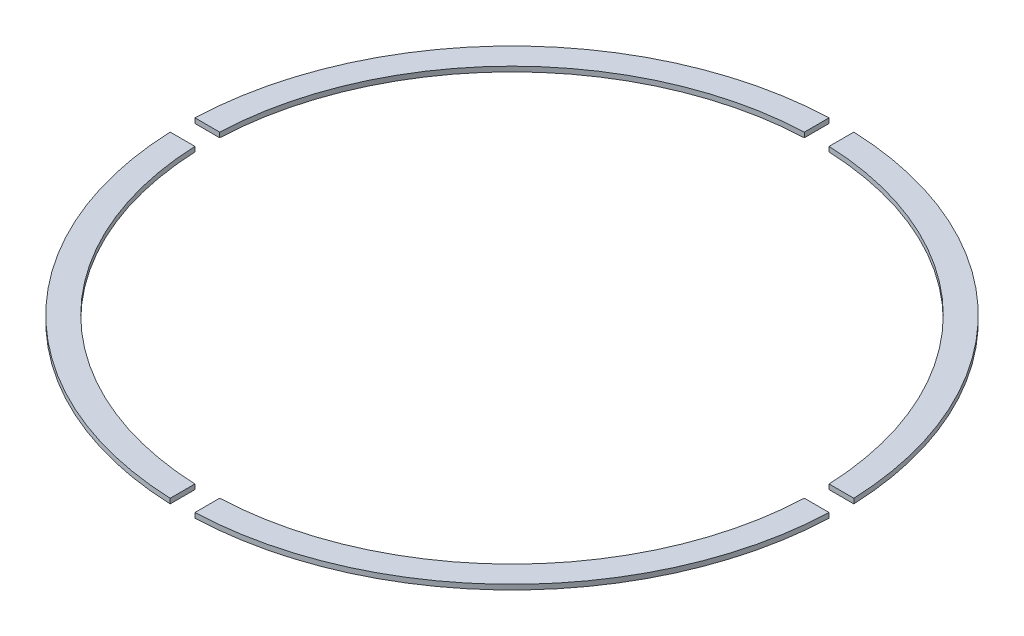
ISO-10303-21;
HEADER;
FILE_DESCRIPTION(('STEP AP214'),'2;1');
FILE_NAME('part.step','',(''),(''),'','','');
FILE_SCHEMA(('AUTOMOTIVE_DESIGN { 1 0 10303 214 1 1 1 1 }'));
ENDSEC;
DATA;
#1=APPLICATION_CONTEXT('core data for automotive mechanical design processes');
#2=APPLICATION_PROTOCOL_DEFINITION('international standard','automotive_design',2000,#1);
#3=PRODUCT_CONTEXT('',#1,'mechanical');
#4=PRODUCT('Part','Part','',(#3));
#5=PRODUCT_RELATED_PRODUCT_CATEGORY('part','',(#4));
#6=PRODUCT_DEFINITION_FORMATION('','',#4);
#7=PRODUCT_DEFINITION_CONTEXT('part definition',#1,'design');
#8=PRODUCT_DEFINITION('design','',#6,#7);
#9=PRODUCT_DEFINITION_SHAPE('','',#8);
#10=(LENGTH_UNIT() NAMED_UNIT(*) SI_UNIT(.MILLI.,.METRE.));
#11=(NAMED_UNIT(*) PLANE_ANGLE_UNIT() SI_UNIT($,.RADIAN.));
#12=(NAMED_UNIT(*) SI_UNIT($,.STERADIAN.) SOLID_ANGLE_UNIT());
#13=UNCERTAINTY_MEASURE_WITH_UNIT(LENGTH_MEASURE(1.E-05),#10,'distance_accuracy_value','');
#14=(GEOMETRIC_REPRESENTATION_CONTEXT(3) GLOBAL_UNCERTAINTY_ASSIGNED_CONTEXT((#13)) GLOBAL_UNIT_ASSIGNED_CONTEXT((#10,
#11,#12)) REPRESENTATION_CONTEXT('',''));
#15=CARTESIAN_POINT('',(0.,0.,0.));
#16=DIRECTION('',(0.,0.,1.));
#17=DIRECTION('',(1.,0.,0.));
#18=AXIS2_PLACEMENT_3D('',#15,#16,#17);
#19=CARTESIAN_POINT('',(0.,1.5,0.));
#20=DIRECTION('',(0.,1.,0.));
#21=DIRECTION('',(0.,0.,1.));
#22=AXIS2_PLACEMENT_3D('',#19,#20,#21);
#23=PLANE('',#22);
#24=DIRECTION('',(0.,0.,-1.));
#25=VECTOR('',#24,1.);
#26=CARTESIAN_POINT('',(7.49999999999945,1.5,-157.644661834944));
#27=LINE('',#26,#25);
#28=CARTESIAN_POINT('',(7.49999999999935,1.5,-184.847910456137));
#29=VERTEX_POINT('',#28);
#30=CARTESIAN_POINT('',(7.4999999999993,1.5,-199.859325526731));
#31=VERTEX_POINT('',#30);
#32=EDGE_CURVE('E12',#29,#31,#27,.T.);
#33=ORIENTED_EDGE('',*,*,#32,.F.);
#34=CARTESIAN_POINT('',(0.,1.5,0.));
#35=DIRECTION('',(0.,1.,0.));
#36=DIRECTION('',(0.,0.,1.));
#37=AXIS2_PLACEMENT_3D('',#34,#35,#36);
#38=CIRCLE('',#37,185.);
#39=CARTESIAN_POINT('',(184.847910456137,1.5,-7.5));
#40=VERTEX_POINT('',#39);
#41=EDGE_CURVE('E46',#40,#29,#38,.T.);
#42=ORIENTED_EDGE('',*,*,#41,.F.);
#43=DIRECTION('',(-1.,0.,0.));
#44=VECTOR('',#43,1.);
#45=CARTESIAN_POINT('',(157.644661834944,1.5,-7.5));
#46=LINE('',#45,#44);
#47=CARTESIAN_POINT('',(199.859325526731,1.5,-7.5));
#48=VERTEX_POINT('',#47);
#49=EDGE_CURVE('E95',#48,#40,#46,.T.);
#50=ORIENTED_EDGE('',*,*,#49,.F.);
#51=CARTESIAN_POINT('',(0.,1.5,0.));
#52=DIRECTION('',(0.,1.,0.));
#53=DIRECTION('',(0.,0.,1.));
#54=AXIS2_PLACEMENT_3D('',#51,#52,#53);
#55=CIRCLE('',#54,200.);
#56=EDGE_CURVE('E92',#48,#31,#55,.T.);
#57=ORIENTED_EDGE('',*,*,#56,.T.);
#58=EDGE_LOOP('',(#33,#42,#50,#57));
#59=FACE_BOUND('',#58,.T.);
#60=ADVANCED_FACE('F43',(#59),#23,.T.);
#61=CARTESIAN_POINT('',(0.,-1.5,0.));
#62=DIRECTION('',(0.,1.,0.));
#63=DIRECTION('',(0.,0.,1.));
#64=AXIS2_PLACEMENT_3D('',#61,#62,#63);
#65=PLANE('',#64);
#66=CARTESIAN_POINT('',(0.,-1.5,0.));
#67=DIRECTION('',(0.,1.,0.));
#68=DIRECTION('',(0.,0.,1.));
#69=AXIS2_PLACEMENT_3D('',#66,#67,#68);
#70=CIRCLE('',#69,185.);
#71=CARTESIAN_POINT('',(184.847910456137,-1.5,-7.5));
#72=VERTEX_POINT('',#71);
#73=CARTESIAN_POINT('',(7.49999999999935,-1.5,-184.847910456137));
#74=VERTEX_POINT('',#73);
#75=EDGE_CURVE('E110',#72,#74,#70,.T.);
#76=ORIENTED_EDGE('',*,*,#75,.T.);
#77=DIRECTION('',(0.,0.,-1.));
#78=VECTOR('',#77,1.);
#79=CARTESIAN_POINT('',(7.49999999999945,-1.5,-157.644661834944));
#80=LINE('',#79,#78);
#81=CARTESIAN_POINT('',(7.4999999999993,-1.5,-199.859325526731));
#82=VERTEX_POINT('',#81);
#83=EDGE_CURVE('E77',#74,#82,#80,.T.);
#84=ORIENTED_EDGE('',*,*,#83,.T.);
#85=CARTESIAN_POINT('',(0.,-1.5,0.));
#86=DIRECTION('',(0.,1.,0.));
#87=DIRECTION('',(0.,0.,1.));
#88=AXIS2_PLACEMENT_3D('',#85,#86,#87);
#89=CIRCLE('',#88,200.);
#90=CARTESIAN_POINT('',(199.859325526731,-1.5,-7.5));
#91=VERTEX_POINT('',#90);
#92=EDGE_CURVE('E103',#91,#82,#89,.T.);
#93=ORIENTED_EDGE('',*,*,#92,.F.);
#94=DIRECTION('',(-1.,0.,0.));
#95=VECTOR('',#94,1.);
#96=CARTESIAN_POINT('',(157.644661834944,-1.5,-7.5));
#97=LINE('',#96,#95);
#98=EDGE_CURVE('E107',#91,#72,#97,.T.);
#99=ORIENTED_EDGE('',*,*,#98,.T.);
#100=EDGE_LOOP('',(#76,#84,#93,#99));
#101=FACE_BOUND('',#100,.T.);
#102=ADVANCED_FACE('F115',(#101),#65,.F.);
#103=CARTESIAN_POINT('',(0.,1.5,0.));
#104=DIRECTION('',(0.,-1.,0.));
#105=DIRECTION('',(0.,0.,-1.));
#106=AXIS2_PLACEMENT_3D('',#103,#104,#105);
#107=CYLINDRICAL_SURFACE('',#106,200.);
#108=ORIENTED_EDGE('',*,*,#92,.T.);
#109=DIRECTION('',(0.,-1.,0.));
#110=VECTOR('',#109,1.);
#111=CARTESIAN_POINT('',(7.4999999999993,1.5,-199.859325526731));
#112=LINE('',#111,#110);
#113=EDGE_CURVE('E60',#82,#31,#112,.F.);
#114=ORIENTED_EDGE('',*,*,#113,.T.);
#115=ORIENTED_EDGE('',*,*,#56,.F.);
#116=DIRECTION('',(0.,-1.,0.));
#117=VECTOR('',#116,1.);
#118=CARTESIAN_POINT('',(199.859325526731,1.5,-7.5));
#119=LINE('',#118,#117);
#120=EDGE_CURVE('E96',#48,#91,#119,.T.);
#121=ORIENTED_EDGE('',*,*,#120,.T.);
#122=EDGE_LOOP('',(#108,#114,#115,#121));
#123=FACE_BOUND('',#122,.T.);
#124=ADVANCED_FACE('F113',(#123),#107,.T.);
#125=CARTESIAN_POINT('',(0.,1.5,0.));
#126=DIRECTION('',(0.,-1.,0.));
#127=DIRECTION('',(0.,0.,-1.));
#128=AXIS2_PLACEMENT_3D('',#125,#126,#127);
#129=CYLINDRICAL_SURFACE('',#128,185.);
#130=DIRECTION('',(0.,-1.,0.));
#131=VECTOR('',#130,1.);
#132=CARTESIAN_POINT('',(7.49999999999935,1.5,-184.847910456137));
#133=LINE('',#132,#131);
#134=EDGE_CURVE('E52',#74,#29,#133,.F.);
#135=ORIENTED_EDGE('',*,*,#134,.F.);
#136=ORIENTED_EDGE('',*,*,#75,.F.);
#137=DIRECTION('',(0.,-1.,0.));
#138=VECTOR('',#137,1.);
#139=CARTESIAN_POINT('',(184.847910456137,1.5,-7.5));
#140=LINE('',#139,#138);
#141=EDGE_CURVE('E85',#40,#72,#140,.T.);
#142=ORIENTED_EDGE('',*,*,#141,.F.);
#143=ORIENTED_EDGE('',*,*,#41,.T.);
#144=EDGE_LOOP('',(#135,#136,#142,#143));
#145=FACE_BOUND('',#144,.T.);
#146=ADVANCED_FACE('F94',(#145),#129,.F.);
#147=CARTESIAN_POINT('',(157.644661834944,-1.5,-7.5));
#148=DIRECTION('',(0.,0.,-1.));
#149=DIRECTION('',(-1.,0.,0.));
#150=AXIS2_PLACEMENT_3D('',#147,#148,#149);
#151=PLANE('',#150);
#152=ORIENTED_EDGE('',*,*,#49,.T.);
#153=ORIENTED_EDGE('',*,*,#141,.T.);
#154=ORIENTED_EDGE('',*,*,#98,.F.);
#155=ORIENTED_EDGE('',*,*,#120,.F.);
#156=EDGE_LOOP('',(#152,#153,#154,#155));
#157=FACE_BOUND('',#156,.T.);
#158=ADVANCED_FACE('F117',(#157),#151,.F.);
#159=CARTESIAN_POINT('',(7.49999999999945,-1.5,-157.644661834944));
#160=DIRECTION('',(1.,0.,0.));
#161=DIRECTION('',(0.,0.,-1.));
#162=AXIS2_PLACEMENT_3D('',#159,#160,#161);
#163=PLANE('',#162);
#164=ORIENTED_EDGE('',*,*,#83,.F.);
#165=ORIENTED_EDGE('',*,*,#134,.T.);
#166=ORIENTED_EDGE('',*,*,#32,.T.);
#167=ORIENTED_EDGE('',*,*,#113,.F.);
#168=EDGE_LOOP('',(#164,#165,#166,#167));
#169=FACE_BOUND('',#168,.T.);
#170=ADVANCED_FACE('F80',(#169),#163,.F.);
#171=CLOSED_SHELL('',(#60,#102,#124,#146,#158,#170));
#172=MANIFOLD_SOLID_BREP('B2',#171);
#173=CARTESIAN_POINT('',(157.644661834944,-1.5,7.5));
#174=DIRECTION('',(0.,0.,1.));
#175=DIRECTION('',(1.,0.,0.));
#176=AXIS2_PLACEMENT_3D('',#173,#174,#175);
#177=PLANE('',#176);
#178=DIRECTION('',(1.,0.,0.));
#179=VECTOR('',#178,1.);
#180=CARTESIAN_POINT('',(157.644661834944,-1.5,7.5));
#181=LINE('',#180,#179);
#182=CARTESIAN_POINT('',(184.847910456137,-1.5,7.5));
#183=VERTEX_POINT('',#182);
#184=CARTESIAN_POINT('',(199.859325526731,-1.5,7.5));
#185=VERTEX_POINT('',#184);
#186=EDGE_CURVE('E238',#183,#185,#181,.T.);
#187=ORIENTED_EDGE('',*,*,#186,.F.);
#188=DIRECTION('',(0.,-1.,0.));
#189=VECTOR('',#188,1.);
#190=CARTESIAN_POINT('',(184.847910456137,1.5,7.5));
#191=LINE('',#190,#189);
#192=CARTESIAN_POINT('',(184.847910456137,1.5,7.5));
#193=VERTEX_POINT('',#192);
#194=EDGE_CURVE('E231',#183,#193,#191,.F.);
#195=ORIENTED_EDGE('',*,*,#194,.T.);
#196=DIRECTION('',(1.,0.,0.));
#197=VECTOR('',#196,1.);
#198=CARTESIAN_POINT('',(157.644661834944,1.5,7.5));
#199=LINE('',#198,#197);
#200=CARTESIAN_POINT('',(199.859325526731,1.5,7.5));
#201=VERTEX_POINT('',#200);
#202=EDGE_CURVE('E228',#193,#201,#199,.T.);
#203=ORIENTED_EDGE('',*,*,#202,.T.);
#204=DIRECTION('',(0.,-1.,0.));
#205=VECTOR('',#204,1.);
#206=CARTESIAN_POINT('',(199.859325526731,1.5,7.5));
#207=LINE('',#206,#205);
#208=EDGE_CURVE('E241',#185,#201,#207,.F.);
#209=ORIENTED_EDGE('',*,*,#208,.F.);
#210=EDGE_LOOP('',(#187,#195,#203,#209));
#211=FACE_BOUND('',#210,.T.);
#212=ADVANCED_FACE('F176',(#211),#177,.F.);
#213=CARTESIAN_POINT('',(0.,1.5,0.));
#214=DIRECTION('',(0.,-1.,0.));
#215=DIRECTION('',(0.,0.,-1.));
#216=AXIS2_PLACEMENT_3D('',#213,#214,#215);
#217=CYLINDRICAL_SURFACE('',#216,185.);
#218=DIRECTION('',(0.,-1.,0.));
#219=VECTOR('',#218,1.);
#220=CARTESIAN_POINT('',(7.50000000000194,1.5,184.847910456137));
#221=LINE('',#220,#219);
#222=CARTESIAN_POINT('',(7.50000000000194,1.5,184.847910456137));
#223=VERTEX_POINT('',#222);
#224=CARTESIAN_POINT('',(7.50000000000194,-1.5,184.847910456137));
#225=VERTEX_POINT('',#224);
#226=EDGE_CURVE('E41',#223,#225,#221,.T.);
#227=ORIENTED_EDGE('',*,*,#226,.F.);
#228=CARTESIAN_POINT('',(0.,1.5,0.));
#229=DIRECTION('',(0.,1.,0.));
#230=DIRECTION('',(0.,0.,1.));
#231=AXIS2_PLACEMENT_3D('',#228,#229,#230);
#232=CIRCLE('',#231,185.);
#233=EDGE_CURVE('E180',#223,#193,#232,.T.);
#234=ORIENTED_EDGE('',*,*,#233,.T.);
#235=ORIENTED_EDGE('',*,*,#194,.F.);
#236=CARTESIAN_POINT('',(0.,-1.5,0.));
#237=DIRECTION('',(0.,1.,0.));
#238=DIRECTION('',(0.,0.,1.));
#239=AXIS2_PLACEMENT_3D('',#236,#237,#238);
#240=CIRCLE('',#239,185.);
#241=EDGE_CURVE('E225',#225,#183,#240,.T.);
#242=ORIENTED_EDGE('',*,*,#241,.F.);
#243=EDGE_LOOP('',(#227,#234,#235,#242));
#244=FACE_BOUND('',#243,.T.);
#245=ADVANCED_FACE('F222',(#244),#217,.F.);
#246=CARTESIAN_POINT('',(0.,1.5,0.));
#247=DIRECTION('',(0.,-1.,0.));
#248=DIRECTION('',(0.,0.,-1.));
#249=AXIS2_PLACEMENT_3D('',#246,#247,#248);
#250=CYLINDRICAL_SURFACE('',#249,200.);
#251=CARTESIAN_POINT('',(0.,1.5,0.));
#252=DIRECTION('',(0.,1.,0.));
#253=DIRECTION('',(0.,0.,1.));
#254=AXIS2_PLACEMENT_3D('',#251,#252,#253);
#255=CIRCLE('',#254,200.);
#256=CARTESIAN_POINT('',(7.50000000000209,1.5,199.859325526731));
#257=VERTEX_POINT('',#256);
#258=EDGE_CURVE('E218',#257,#201,#255,.T.);
#259=ORIENTED_EDGE('',*,*,#258,.F.);
#260=DIRECTION('',(0.,-1.,0.));
#261=VECTOR('',#260,1.);
#262=CARTESIAN_POINT('',(7.50000000000209,1.5,199.859325526731));
#263=LINE('',#262,#261);
#264=CARTESIAN_POINT('',(7.50000000000209,-1.5,199.859325526731));
#265=VERTEX_POINT('',#264);
#266=EDGE_CURVE('E193',#257,#265,#263,.T.);
#267=ORIENTED_EDGE('',*,*,#266,.T.);
#268=CARTESIAN_POINT('',(0.,-1.5,0.));
#269=DIRECTION('',(0.,1.,0.));
#270=DIRECTION('',(0.,0.,1.));
#271=AXIS2_PLACEMENT_3D('',#268,#269,#270);
#272=CIRCLE('',#271,200.);
#273=EDGE_CURVE('E229',#265,#185,#272,.T.);
#274=ORIENTED_EDGE('',*,*,#273,.T.);
#275=ORIENTED_EDGE('',*,*,#208,.T.);
#276=EDGE_LOOP('',(#259,#267,#274,#275));
#277=FACE_BOUND('',#276,.T.);
#278=ADVANCED_FACE('F246',(#277),#250,.T.);
#279=CARTESIAN_POINT('',(0.,-1.5,0.));
#280=DIRECTION('',(0.,1.,0.));
#281=DIRECTION('',(0.,0.,1.));
#282=AXIS2_PLACEMENT_3D('',#279,#280,#281);
#283=PLANE('',#282);
#284=ORIENTED_EDGE('',*,*,#273,.F.);
#285=DIRECTION('',(0.,0.,-1.));
#286=VECTOR('',#285,1.);
#287=CARTESIAN_POINT('',(7.50000000000165,-1.5,157.644661834944));
#288=LINE('',#287,#286);
#289=EDGE_CURVE('E197',#265,#225,#288,.T.);
#290=ORIENTED_EDGE('',*,*,#289,.T.);
#291=ORIENTED_EDGE('',*,*,#241,.T.);
#292=ORIENTED_EDGE('',*,*,#186,.T.);
#293=EDGE_LOOP('',(#284,#290,#291,#292));
#294=FACE_BOUND('',#293,.T.);
#295=ADVANCED_FACE('F250',(#294),#283,.F.);
#296=CARTESIAN_POINT('',(0.,1.5,0.));
#297=DIRECTION('',(0.,1.,0.));
#298=DIRECTION('',(0.,0.,1.));
#299=AXIS2_PLACEMENT_3D('',#296,#297,#298);
#300=PLANE('',#299);
#301=DIRECTION('',(0.,0.,-1.));
#302=VECTOR('',#301,1.);
#303=CARTESIAN_POINT('',(7.50000000000165,1.5,157.644661834944));
#304=LINE('',#303,#302);
#305=EDGE_CURVE('E185',#257,#223,#304,.T.);
#306=ORIENTED_EDGE('',*,*,#305,.F.);
#307=ORIENTED_EDGE('',*,*,#258,.T.);
#308=ORIENTED_EDGE('',*,*,#202,.F.);
#309=ORIENTED_EDGE('',*,*,#233,.F.);
#310=EDGE_LOOP('',(#306,#307,#308,#309));
#311=FACE_BOUND('',#310,.T.);
#312=ADVANCED_FACE('F178',(#311),#300,.T.);
#313=CARTESIAN_POINT('',(7.50000000000165,-1.5,157.644661834944));
#314=DIRECTION('',(1.,0.,0.));
#315=DIRECTION('',(0.,0.,-1.));
#316=AXIS2_PLACEMENT_3D('',#313,#314,#315);
#317=PLANE('',#316);
#318=ORIENTED_EDGE('',*,*,#305,.T.);
#319=ORIENTED_EDGE('',*,*,#226,.T.);
#320=ORIENTED_EDGE('',*,*,#289,.F.);
#321=ORIENTED_EDGE('',*,*,#266,.F.);
#322=EDGE_LOOP('',(#318,#319,#320,#321));
#323=FACE_BOUND('',#322,.T.);
#324=ADVANCED_FACE('F214',(#323),#317,.F.);
#325=CLOSED_SHELL('',(#212,#245,#278,#295,#312,#324));
#326=MANIFOLD_SOLID_BREP('B6',#325);
#327=CARTESIAN_POINT('',(0.,1.5,0.));
#328=DIRECTION('',(0.,-1.,0.));
#329=DIRECTION('',(0.,0.,-1.));
#330=AXIS2_PLACEMENT_3D('',#327,#328,#329);
#331=CYLINDRICAL_SURFACE('',#330,185.);
#332=DIRECTION('',(0.,-1.,0.));
#333=VECTOR('',#332,1.);
#334=CARTESIAN_POINT('',(-184.847910456137,1.5,7.5));
#335=LINE('',#334,#333);
#336=CARTESIAN_POINT('',(-184.847910456137,1.5,7.5));
#337=VERTEX_POINT('',#336);
#338=CARTESIAN_POINT('',(-184.847910456137,-1.5,7.5));
#339=VERTEX_POINT('',#338);
#340=EDGE_CURVE('E174',#337,#339,#335,.T.);
#341=ORIENTED_EDGE('',*,*,#340,.F.);
#342=CARTESIAN_POINT('',(0.,1.5,0.));
#343=DIRECTION('',(0.,1.,0.));
#344=DIRECTION('',(0.,0.,1.));
#345=AXIS2_PLACEMENT_3D('',#342,#343,#344);
#346=CIRCLE('',#345,185.);
#347=CARTESIAN_POINT('',(-7.49999999999806,1.5,184.847910456137));
#348=VERTEX_POINT('',#347);
#349=EDGE_CURVE('E312',#337,#348,#346,.T.);
#350=ORIENTED_EDGE('',*,*,#349,.T.);
#351=DIRECTION('',(0.,-1.,0.));
#352=VECTOR('',#351,1.);
#353=CARTESIAN_POINT('',(-7.49999999999806,1.5,184.847910456137));
#354=LINE('',#353,#352);
#355=CARTESIAN_POINT('',(-7.49999999999806,-1.5,184.847910456137));
#356=VERTEX_POINT('',#355);
#357=EDGE_CURVE('E346',#356,#348,#354,.F.);
#358=ORIENTED_EDGE('',*,*,#357,.F.);
#359=CARTESIAN_POINT('',(0.,-1.5,0.));
#360=DIRECTION('',(0.,1.,0.));
#361=DIRECTION('',(0.,0.,1.));
#362=AXIS2_PLACEMENT_3D('',#359,#360,#361);
#363=CIRCLE('',#362,185.);
#364=EDGE_CURVE('E363',#339,#356,#363,.T.);
#365=ORIENTED_EDGE('',*,*,#364,.F.);
#366=EDGE_LOOP('',(#341,#350,#358,#365));
#367=FACE_BOUND('',#366,.T.);
#368=ADVANCED_FACE('F308',(#367),#331,.F.);
#369=CARTESIAN_POINT('',(0.,1.5,0.));
#370=DIRECTION('',(0.,-1.,0.));
#371=DIRECTION('',(0.,0.,-1.));
#372=AXIS2_PLACEMENT_3D('',#369,#370,#371);
#373=CYLINDRICAL_SURFACE('',#372,200.);
#374=CARTESIAN_POINT('',(0.,1.5,0.));
#375=DIRECTION('',(0.,1.,0.));
#376=DIRECTION('',(0.,0.,1.));
#377=AXIS2_PLACEMENT_3D('',#374,#375,#376);
#378=CIRCLE('',#377,200.);
#379=CARTESIAN_POINT('',(-199.859325526731,1.5,7.5));
#380=VERTEX_POINT('',#379);
#381=CARTESIAN_POINT('',(-7.4999999999979,1.5,199.859325526732));
#382=VERTEX_POINT('',#381);
#383=EDGE_CURVE('E375',#380,#382,#378,.T.);
#384=ORIENTED_EDGE('',*,*,#383,.F.);
#385=DIRECTION('',(0.,-1.,0.));
#386=VECTOR('',#385,1.);
#387=CARTESIAN_POINT('',(-199.859325526731,1.5,7.5));
#388=LINE('',#387,#386);
#389=CARTESIAN_POINT('',(-199.859325526731,-1.5,7.5));
#390=VERTEX_POINT('',#389);
#391=EDGE_CURVE('E327',#380,#390,#388,.T.);
#392=ORIENTED_EDGE('',*,*,#391,.T.);
#393=CARTESIAN_POINT('',(0.,-1.5,0.));
#394=DIRECTION('',(0.,1.,0.));
#395=DIRECTION('',(0.,0.,1.));
#396=AXIS2_PLACEMENT_3D('',#393,#394,#395);
#397=CIRCLE('',#396,200.);
#398=CARTESIAN_POINT('',(-7.4999999999979,-1.5,199.859325526732));
#399=VERTEX_POINT('',#398);
#400=EDGE_CURVE('E364',#390,#399,#397,.T.);
#401=ORIENTED_EDGE('',*,*,#400,.T.);
#402=DIRECTION('',(0.,-1.,0.));
#403=VECTOR('',#402,1.);
#404=CARTESIAN_POINT('',(-7.4999999999979,1.5,199.859325526732));
#405=LINE('',#404,#403);
#406=EDGE_CURVE('E369',#399,#382,#405,.F.);
#407=ORIENTED_EDGE('',*,*,#406,.T.);
#408=EDGE_LOOP('',(#384,#392,#401,#407));
#409=FACE_BOUND('',#408,.T.);
#410=ADVANCED_FACE('F381',(#409),#373,.T.);
#411=CARTESIAN_POINT('',(0.,-1.5,0.));
#412=DIRECTION('',(0.,1.,0.));
#413=DIRECTION('',(0.,0.,1.));
#414=AXIS2_PLACEMENT_3D('',#411,#412,#413);
#415=PLANE('',#414);
#416=ORIENTED_EDGE('',*,*,#400,.F.);
#417=DIRECTION('',(1.,0.,0.));
#418=VECTOR('',#417,1.);
#419=CARTESIAN_POINT('',(-157.644661834944,-1.5,7.5));
#420=LINE('',#419,#418);
#421=EDGE_CURVE('E373',#390,#339,#420,.T.);
#422=ORIENTED_EDGE('',*,*,#421,.T.);
#423=ORIENTED_EDGE('',*,*,#364,.T.);
#424=DIRECTION('',(0.,0.,1.));
#425=VECTOR('',#424,1.);
#426=CARTESIAN_POINT('',(-7.49999999999835,-1.5,157.644661834944));
#427=LINE('',#426,#425);
#428=EDGE_CURVE('E349',#356,#399,#427,.T.);
#429=ORIENTED_EDGE('',*,*,#428,.T.);
#430=EDGE_LOOP('',(#416,#422,#423,#429));
#431=FACE_BOUND('',#430,.T.);
#432=ADVANCED_FACE('F380',(#431),#415,.F.);
#433=CARTESIAN_POINT('',(0.,1.5,0.));
#434=DIRECTION('',(0.,1.,0.));
#435=DIRECTION('',(0.,0.,1.));
#436=AXIS2_PLACEMENT_3D('',#433,#434,#435);
#437=PLANE('',#436);
#438=DIRECTION('',(1.,0.,0.));
#439=VECTOR('',#438,1.);
#440=CARTESIAN_POINT('',(-157.644661834944,1.5,7.5));
#441=LINE('',#440,#439);
#442=EDGE_CURVE('E318',#380,#337,#441,.T.);
#443=ORIENTED_EDGE('',*,*,#442,.F.);
#444=ORIENTED_EDGE('',*,*,#383,.T.);
#445=DIRECTION('',(0.,0.,1.));
#446=VECTOR('',#445,1.);
#447=CARTESIAN_POINT('',(-7.49999999999835,1.5,157.644661834944));
#448=LINE('',#447,#446);
#449=EDGE_CURVE('E341',#348,#382,#448,.T.);
#450=ORIENTED_EDGE('',*,*,#449,.F.);
#451=ORIENTED_EDGE('',*,*,#349,.F.);
#452=EDGE_LOOP('',(#443,#444,#450,#451));
#453=FACE_BOUND('',#452,.T.);
#454=ADVANCED_FACE('F310',(#453),#437,.T.);
#455=CARTESIAN_POINT('',(-7.49999999999835,-1.5,157.644661834944));
#456=DIRECTION('',(-1.,0.,0.));
#457=DIRECTION('',(0.,0.,1.));
#458=AXIS2_PLACEMENT_3D('',#455,#456,#457);
#459=PLANE('',#458);
#460=ORIENTED_EDGE('',*,*,#428,.F.);
#461=ORIENTED_EDGE('',*,*,#357,.T.);
#462=ORIENTED_EDGE('',*,*,#449,.T.);
#463=ORIENTED_EDGE('',*,*,#406,.F.);
#464=EDGE_LOOP('',(#460,#461,#462,#463));
#465=FACE_BOUND('',#464,.T.);
#466=ADVANCED_FACE('F382',(#465),#459,.F.);
#467=CARTESIAN_POINT('',(-157.644661834944,-1.5,7.5));
#468=DIRECTION('',(0.,0.,1.));
#469=DIRECTION('',(1.,0.,0.));
#470=AXIS2_PLACEMENT_3D('',#467,#468,#469);
#471=PLANE('',#470);
#472=ORIENTED_EDGE('',*,*,#442,.T.);
#473=ORIENTED_EDGE('',*,*,#340,.T.);
#474=ORIENTED_EDGE('',*,*,#421,.F.);
#475=ORIENTED_EDGE('',*,*,#391,.F.);
#476=EDGE_LOOP('',(#472,#473,#474,#475));
#477=FACE_BOUND('',#476,.T.);
#478=ADVANCED_FACE('F353',(#477),#471,.F.);
#479=CLOSED_SHELL('',(#368,#410,#432,#454,#466,#478));
#480=MANIFOLD_SOLID_BREP('B35',#479);
#481=CARTESIAN_POINT('',(0.,1.5,0.));
#482=DIRECTION('',(0.,-1.,0.));
#483=DIRECTION('',(0.,0.,-1.));
#484=AXIS2_PLACEMENT_3D('',#481,#482,#483);
#485=CYLINDRICAL_SURFACE('',#484,185.);
#486=DIRECTION('',(0.,-1.,0.));
#487=VECTOR('',#486,1.);
#488=CARTESIAN_POINT('',(-7.50000000000065,1.5,-184.847910456137));
#489=LINE('',#488,#487);
#490=CARTESIAN_POINT('',(-7.50000000000065,1.5,-184.847910456137));
#491=VERTEX_POINT('',#490);
#492=CARTESIAN_POINT('',(-7.50000000000065,-1.5,-184.847910456137));
#493=VERTEX_POINT('',#492);
#494=EDGE_CURVE('E306',#491,#493,#489,.T.);
#495=ORIENTED_EDGE('',*,*,#494,.F.);
#496=CARTESIAN_POINT('',(0.,1.5,0.));
#497=DIRECTION('',(0.,1.,0.));
#498=DIRECTION('',(0.,0.,1.));
#499=AXIS2_PLACEMENT_3D('',#496,#497,#498);
#500=CIRCLE('',#499,185.);
#501=CARTESIAN_POINT('',(-184.847910456137,1.5,-7.5));
#502=VERTEX_POINT('',#501);
#503=EDGE_CURVE('E481',#491,#502,#500,.T.);
#504=ORIENTED_EDGE('',*,*,#503,.T.);
#505=DIRECTION('',(0.,-1.,0.));
#506=VECTOR('',#505,1.);
#507=CARTESIAN_POINT('',(-184.847910456137,1.5,-7.5));
#508=LINE('',#507,#506);
#509=CARTESIAN_POINT('',(-184.847910456137,-1.5,-7.5));
#510=VERTEX_POINT('',#509);
#511=EDGE_CURVE('E439',#510,#502,#508,.F.);
#512=ORIENTED_EDGE('',*,*,#511,.F.);
#513=CARTESIAN_POINT('',(0.,-1.5,0.));
#514=DIRECTION('',(0.,1.,0.));
#515=DIRECTION('',(0.,0.,1.));
#516=AXIS2_PLACEMENT_3D('',#513,#514,#515);
#517=CIRCLE('',#516,185.);
#518=EDGE_CURVE('E485',#493,#510,#517,.T.);
#519=ORIENTED_EDGE('',*,*,#518,.F.);
#520=EDGE_LOOP('',(#495,#504,#512,#519));
#521=FACE_BOUND('',#520,.T.);
#522=ADVANCED_FACE('F431',(#521),#485,.F.);
#523=CARTESIAN_POINT('',(0.,1.5,0.));
#524=DIRECTION('',(0.,-1.,0.));
#525=DIRECTION('',(0.,0.,-1.));
#526=AXIS2_PLACEMENT_3D('',#523,#524,#525);
#527=CYLINDRICAL_SURFACE('',#526,200.);
#528=CARTESIAN_POINT('',(0.,1.5,0.));
#529=DIRECTION('',(0.,1.,0.));
#530=DIRECTION('',(0.,0.,1.));
#531=AXIS2_PLACEMENT_3D('',#528,#529,#530);
#532=CIRCLE('',#531,200.);
#533=CARTESIAN_POINT('',(-7.5000000000007,1.5,-199.859325526731));
#534=VERTEX_POINT('',#533);
#535=CARTESIAN_POINT('',(-199.859325526731,1.5,-7.5));
#536=VERTEX_POINT('',#535);
#537=EDGE_CURVE('E476',#534,#536,#532,.T.);
#538=ORIENTED_EDGE('',*,*,#537,.F.);
#539=DIRECTION('',(0.,-1.,0.));
#540=VECTOR('',#539,1.);
#541=CARTESIAN_POINT('',(-7.5000000000007,1.5,-199.859325526731));
#542=LINE('',#541,#540);
#543=CARTESIAN_POINT('',(-7.5000000000007,-1.5,-199.859325526731));
#544=VERTEX_POINT('',#543);
#545=EDGE_CURVE('E489',#534,#544,#542,.T.);
#546=ORIENTED_EDGE('',*,*,#545,.T.);
#547=CARTESIAN_POINT('',(0.,-1.5,0.));
#548=DIRECTION('',(0.,1.,0.));
#549=DIRECTION('',(0.,0.,1.));
#550=AXIS2_PLACEMENT_3D('',#547,#548,#549);
#551=CIRCLE('',#550,200.);
#552=CARTESIAN_POINT('',(-199.859325526731,-1.5,-7.5));
#553=VERTEX_POINT('',#552);
#554=EDGE_CURVE('E484',#544,#553,#551,.T.);
#555=ORIENTED_EDGE('',*,*,#554,.T.);
#556=DIRECTION('',(0.,-1.,0.));
#557=VECTOR('',#556,1.);
#558=CARTESIAN_POINT('',(-199.859325526731,1.5,-7.5));
#559=LINE('',#558,#557);
#560=EDGE_CURVE('E495',#553,#536,#559,.F.);
#561=ORIENTED_EDGE('',*,*,#560,.T.);
#562=EDGE_LOOP('',(#538,#546,#555,#561));
#563=FACE_BOUND('',#562,.T.);
#564=ADVANCED_FACE('F433',(#563),#527,.T.);
#565=CARTESIAN_POINT('',(0.,-1.5,0.));
#566=DIRECTION('',(0.,1.,0.));
#567=DIRECTION('',(0.,0.,1.));
#568=AXIS2_PLACEMENT_3D('',#565,#566,#567);
#569=PLANE('',#568);
#570=ORIENTED_EDGE('',*,*,#554,.F.);
#571=DIRECTION('',(0.,0.,1.));
#572=VECTOR('',#571,1.);
#573=CARTESIAN_POINT('',(-7.50000000000055,-1.5,-157.644661834944));
#574=LINE('',#573,#572);
#575=EDGE_CURVE('E497',#544,#493,#574,.T.);
#576=ORIENTED_EDGE('',*,*,#575,.T.);
#577=ORIENTED_EDGE('',*,*,#518,.T.);
#578=DIRECTION('',(-1.,0.,0.));
#579=VECTOR('',#578,1.);
#580=CARTESIAN_POINT('',(-157.644661834944,-1.5,-7.5));
#581=LINE('',#580,#579);
#582=EDGE_CURVE('E453',#510,#553,#581,.T.);
#583=ORIENTED_EDGE('',*,*,#582,.T.);
#584=EDGE_LOOP('',(#570,#576,#577,#583));
#585=FACE_BOUND('',#584,.T.);
#586=ADVANCED_FACE('F503',(#585),#569,.F.);
#587=CARTESIAN_POINT('',(0.,1.5,0.));
#588=DIRECTION('',(0.,1.,0.));
#589=DIRECTION('',(0.,0.,1.));
#590=AXIS2_PLACEMENT_3D('',#587,#588,#589);
#591=PLANE('',#590);
#592=DIRECTION('',(0.,0.,1.));
#593=VECTOR('',#592,1.);
#594=CARTESIAN_POINT('',(-7.50000000000055,1.5,-157.644661834944));
#595=LINE('',#594,#593);
#596=EDGE_CURVE('E445',#534,#491,#595,.T.);
#597=ORIENTED_EDGE('',*,*,#596,.F.);
#598=ORIENTED_EDGE('',*,*,#537,.T.);
#599=DIRECTION('',(-1.,0.,0.));
#600=VECTOR('',#599,1.);
#601=CARTESIAN_POINT('',(-157.644661834944,1.5,-7.5));
#602=LINE('',#601,#600);
#603=EDGE_CURVE('E470',#502,#536,#602,.T.);
#604=ORIENTED_EDGE('',*,*,#603,.F.);
#605=ORIENTED_EDGE('',*,*,#503,.F.);
#606=EDGE_LOOP('',(#597,#598,#604,#605));
#607=FACE_BOUND('',#606,.T.);
#608=ADVANCED_FACE('F480',(#607),#591,.T.);
#609=CARTESIAN_POINT('',(-157.644661834944,-1.5,-7.5));
#610=DIRECTION('',(0.,0.,-1.));
#611=DIRECTION('',(-1.,0.,0.));
#612=AXIS2_PLACEMENT_3D('',#609,#610,#611);
#613=PLANE('',#612);
#614=ORIENTED_EDGE('',*,*,#582,.F.);
#615=ORIENTED_EDGE('',*,*,#511,.T.);
#616=ORIENTED_EDGE('',*,*,#603,.T.);
#617=ORIENTED_EDGE('',*,*,#560,.F.);
#618=EDGE_LOOP('',(#614,#615,#616,#617));
#619=FACE_BOUND('',#618,.T.);
#620=ADVANCED_FACE('F469',(#619),#613,.F.);
#621=CARTESIAN_POINT('',(-7.50000000000055,-1.5,-157.644661834944));
#622=DIRECTION('',(-1.,0.,0.));
#623=DIRECTION('',(0.,0.,1.));
#624=AXIS2_PLACEMENT_3D('',#621,#622,#623);
#625=PLANE('',#624);
#626=ORIENTED_EDGE('',*,*,#596,.T.);
#627=ORIENTED_EDGE('',*,*,#494,.T.);
#628=ORIENTED_EDGE('',*,*,#575,.F.);
#629=ORIENTED_EDGE('',*,*,#545,.F.);
#630=EDGE_LOOP('',(#626,#627,#628,#629));
#631=FACE_BOUND('',#630,.T.);
#632=ADVANCED_FACE('F504',(#631),#625,.F.);
#633=CLOSED_SHELL('',(#522,#564,#586,#608,#620,#632));
#634=MANIFOLD_SOLID_BREP('B168',#633);
#635=ADVANCED_BREP_SHAPE_REPRESENTATION('',(#18,#172,#326,#480,#634),#14);
#636=SHAPE_DEFINITION_REPRESENTATION(#9,#635);
ENDSEC;
END-ISO-10303-21;
